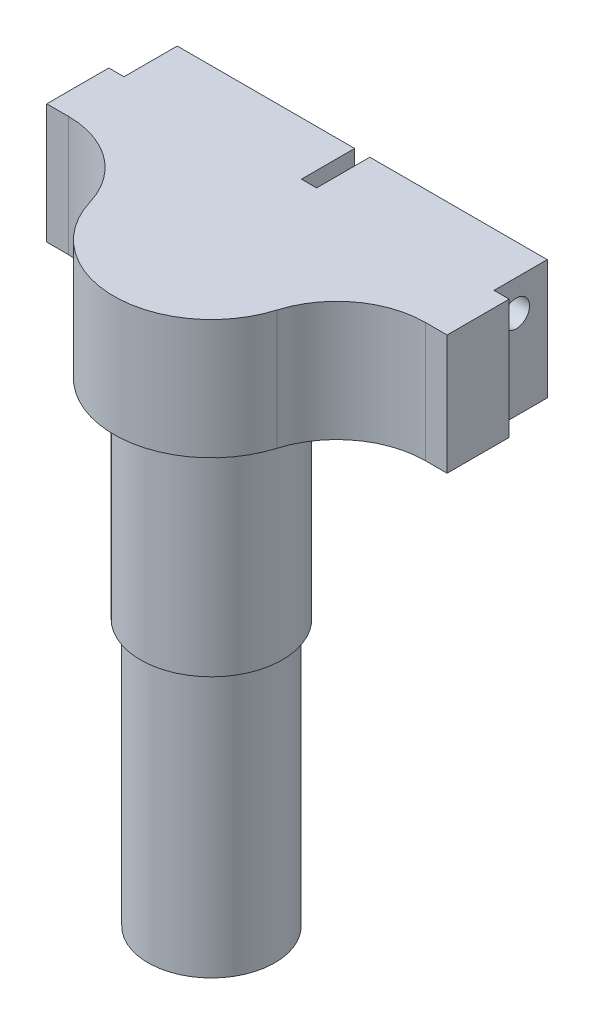
ISO-10303-21;
HEADER;
FILE_DESCRIPTION(('STEP AP214'),'2;1');
FILE_NAME('part.step','',(''),(''),'','','');
FILE_SCHEMA(('AUTOMOTIVE_DESIGN { 1 0 10303 214 1 1 1 1 }'));
ENDSEC;
DATA;
#1=APPLICATION_CONTEXT('core data for automotive mechanical design processes');
#2=APPLICATION_PROTOCOL_DEFINITION('international standard','automotive_design',2000,#1);
#3=PRODUCT_CONTEXT('',#1,'mechanical');
#4=PRODUCT('Part','Part','',(#3));
#5=PRODUCT_RELATED_PRODUCT_CATEGORY('part','',(#4));
#6=PRODUCT_DEFINITION_FORMATION('','',#4);
#7=PRODUCT_DEFINITION_CONTEXT('part definition',#1,'design');
#8=PRODUCT_DEFINITION('design','',#6,#7);
#9=PRODUCT_DEFINITION_SHAPE('','',#8);
#10=(LENGTH_UNIT() NAMED_UNIT(*) SI_UNIT(.MILLI.,.METRE.));
#11=(NAMED_UNIT(*) PLANE_ANGLE_UNIT() SI_UNIT($,.RADIAN.));
#12=(NAMED_UNIT(*) SI_UNIT($,.STERADIAN.) SOLID_ANGLE_UNIT());
#13=UNCERTAINTY_MEASURE_WITH_UNIT(LENGTH_MEASURE(1.E-05),#10,'distance_accuracy_value','');
#14=(GEOMETRIC_REPRESENTATION_CONTEXT(3) GLOBAL_UNCERTAINTY_ASSIGNED_CONTEXT((#13)) GLOBAL_UNIT_ASSIGNED_CONTEXT((#10,
#11,#12)) REPRESENTATION_CONTEXT('',''));
#15=CARTESIAN_POINT('',(0.,0.,0.));
#16=DIRECTION('',(0.,0.,1.));
#17=DIRECTION('',(1.,0.,0.));
#18=AXIS2_PLACEMENT_3D('',#15,#16,#17);
#19=CARTESIAN_POINT('',(22.565,-6.5,8.));
#20=DIRECTION('',(0.,-1.,0.));
#21=DIRECTION('',(0.,0.,-1.));
#22=AXIS2_PLACEMENT_3D('',#19,#20,#21);
#23=PLANE('',#22);
#24=CARTESIAN_POINT('',(22.565,-6.5,8.));
#25=DIRECTION('',(0.,-1.,0.));
#26=DIRECTION('',(0.,0.,-1.));
#27=AXIS2_PLACEMENT_3D('',#24,#25,#26);
#28=CIRCLE('',#27,10.);
#29=CARTESIAN_POINT('',(22.565,-6.5,-2.));
#30=VERTEX_POINT('',#29);
#31=EDGE_CURVE('E11',#30,#30,#28,.F.);
#32=ORIENTED_EDGE('',*,*,#31,.T.);
#33=EDGE_LOOP('',(#32));
#34=FACE_BOUND('',#33,.T.);
#35=DIRECTION('',(1.,0.,0.));
#36=VECTOR('',#35,1.);
#37=CARTESIAN_POINT('',(0.,-6.5,3.99999999999998));
#38=LINE('',#37,#36);
#39=CARTESIAN_POINT('',(42.6896117974981,-6.5,3.99999999999998));
#40=VERTEX_POINT('',#39);
#41=CARTESIAN_POINT('',(45.13,-6.5,3.99999999999998));
#42=VERTEX_POINT('',#41);
#43=EDGE_CURVE('E182',#40,#42,#38,.T.);
#44=ORIENTED_EDGE('',*,*,#43,.F.);
#45=CARTESIAN_POINT('',(42.6896117974981,-6.5,14.));
#46=DIRECTION('',(0.,-1.,0.));
#47=DIRECTION('',(0.,0.,-1.));
#48=AXIS2_PLACEMENT_3D('',#45,#46,#47);
#49=CIRCLE('',#48,10.);
#50=CARTESIAN_POINT('',(33.106463322499,-6.5,11.1428571428571));
#51=VERTEX_POINT('',#50);
#52=EDGE_CURVE('E352',#40,#51,#49,.F.);
#53=ORIENTED_EDGE('',*,*,#52,.T.);
#54=CARTESIAN_POINT('',(22.565,-6.5,8.));
#55=DIRECTION('',(0.,-1.,0.));
#56=DIRECTION('',(0.,0.,-1.));
#57=AXIS2_PLACEMENT_3D('',#54,#55,#56);
#58=CIRCLE('',#57,11.);
#59=CARTESIAN_POINT('',(12.023536677501,-6.5,11.1428571428571));
#60=VERTEX_POINT('',#59);
#61=EDGE_CURVE('E291',#51,#60,#58,.T.);
#62=ORIENTED_EDGE('',*,*,#61,.T.);
#63=CARTESIAN_POINT('',(2.4403882025019,-6.5,14.));
#64=DIRECTION('',(0.,-1.,0.));
#65=DIRECTION('',(0.,0.,-1.));
#66=AXIS2_PLACEMENT_3D('',#63,#64,#65);
#67=CIRCLE('',#66,10.);
#68=CARTESIAN_POINT('',(2.4403882025019,-6.5,3.99999999999998));
#69=VERTEX_POINT('',#68);
#70=EDGE_CURVE('E59',#60,#69,#67,.F.);
#71=ORIENTED_EDGE('',*,*,#70,.T.);
#72=CARTESIAN_POINT('',(0.,-6.5,3.99999999999998));
#73=VERTEX_POINT('',#72);
#74=EDGE_CURVE('E186',#73,#69,#38,.T.);
#75=ORIENTED_EDGE('',*,*,#74,.F.);
#76=DIRECTION('',(0.,0.,-1.));
#77=VECTOR('',#76,1.);
#78=CARTESIAN_POINT('',(0.,-6.5,0.));
#79=LINE('',#78,#77);
#80=CARTESIAN_POINT('',(0.,-6.5,-3.));
#81=VERTEX_POINT('',#80);
#82=EDGE_CURVE('E180',#73,#81,#79,.T.);
#83=ORIENTED_EDGE('',*,*,#82,.T.);
#84=DIRECTION('',(-1.,0.,0.));
#85=VECTOR('',#84,1.);
#86=CARTESIAN_POINT('',(22.565,-6.5,-3.));
#87=LINE('',#86,#85);
#88=CARTESIAN_POINT('',(1.71,-6.5,-3.));
#89=VERTEX_POINT('',#88);
#90=EDGE_CURVE('E261',#89,#81,#87,.T.);
#91=ORIENTED_EDGE('',*,*,#90,.F.);
#92=DIRECTION('',(0.,0.,-1.));
#93=VECTOR('',#92,1.);
#94=CARTESIAN_POINT('',(1.71,-6.5,-6.));
#95=LINE('',#94,#93);
#96=CARTESIAN_POINT('',(1.71,-6.5,-9.));
#97=VERTEX_POINT('',#96);
#98=EDGE_CURVE('E296',#89,#97,#95,.T.);
#99=ORIENTED_EDGE('',*,*,#98,.T.);
#100=DIRECTION('',(-1.,0.,0.));
#101=VECTOR('',#100,1.);
#102=CARTESIAN_POINT('',(22.565,-6.5,-9.));
#103=LINE('',#102,#101);
#104=CARTESIAN_POINT('',(21.71,-6.5,-9.));
#105=VERTEX_POINT('',#104);
#106=EDGE_CURVE('E264',#105,#97,#103,.T.);
#107=ORIENTED_EDGE('',*,*,#106,.F.);
#108=DIRECTION('',(0.,0.,1.));
#109=VECTOR('',#108,1.);
#110=CARTESIAN_POINT('',(21.71,-6.5,-12.));
#111=LINE('',#110,#109);
#112=CARTESIAN_POINT('',(21.71,-6.5,-3.));
#113=VERTEX_POINT('',#112);
#114=EDGE_CURVE('E300',#105,#113,#111,.T.);
#115=ORIENTED_EDGE('',*,*,#114,.T.);
#116=DIRECTION('',(-1.,0.,0.));
#117=VECTOR('',#116,1.);
#118=CARTESIAN_POINT('',(22.565,-6.5,-3.));
#119=LINE('',#118,#117);
#120=CARTESIAN_POINT('',(23.42,-6.5,-3.));
#121=VERTEX_POINT('',#120);
#122=EDGE_CURVE('E268',#121,#113,#119,.T.);
#123=ORIENTED_EDGE('',*,*,#122,.F.);
#124=DIRECTION('',(0.,0.,-1.));
#125=VECTOR('',#124,1.);
#126=CARTESIAN_POINT('',(23.42,-6.5,-6.));
#127=LINE('',#126,#125);
#128=CARTESIAN_POINT('',(23.42,-6.5,-9.));
#129=VERTEX_POINT('',#128);
#130=EDGE_CURVE('E303',#121,#129,#127,.T.);
#131=ORIENTED_EDGE('',*,*,#130,.T.);
#132=DIRECTION('',(-1.,0.,0.));
#133=VECTOR('',#132,1.);
#134=CARTESIAN_POINT('',(22.565,-6.5,-9.));
#135=LINE('',#134,#133);
#136=CARTESIAN_POINT('',(43.42,-6.5,-9.));
#137=VERTEX_POINT('',#136);
#138=EDGE_CURVE('E254',#137,#129,#135,.T.);
#139=ORIENTED_EDGE('',*,*,#138,.F.);
#140=DIRECTION('',(0.,0.,1.));
#141=VECTOR('',#140,1.);
#142=CARTESIAN_POINT('',(43.42,-6.5,-12.));
#143=LINE('',#142,#141);
#144=CARTESIAN_POINT('',(43.42,-6.5,-3.));
#145=VERTEX_POINT('',#144);
#146=EDGE_CURVE('E284',#137,#145,#143,.T.);
#147=ORIENTED_EDGE('',*,*,#146,.T.);
#148=DIRECTION('',(-1.,0.,0.));
#149=VECTOR('',#148,1.);
#150=CARTESIAN_POINT('',(22.565,-6.5,-3.));
#151=LINE('',#150,#149);
#152=CARTESIAN_POINT('',(45.13,-6.5,-3.));
#153=VERTEX_POINT('',#152);
#154=EDGE_CURVE('E257',#153,#145,#151,.T.);
#155=ORIENTED_EDGE('',*,*,#154,.F.);
#156=DIRECTION('',(0.,0.,1.));
#157=VECTOR('',#156,1.);
#158=CARTESIAN_POINT('',(45.13,-6.5,-6.));
#159=LINE('',#158,#157);
#160=EDGE_CURVE('E287',#153,#42,#159,.T.);
#161=ORIENTED_EDGE('',*,*,#160,.T.);
#162=EDGE_LOOP('',(#44,#53,#62,#71,#75,#83,#91,#99,#107,#115,#123,#131,#139,#147,#155,#161));
#163=FACE_BOUND('',#162,.T.);
#164=ADVANCED_FACE('F43',(#34,#163),#23,.T.);
#165=CARTESIAN_POINT('',(22.565,7.,8.));
#166=DIRECTION('',(0.,1.,0.));
#167=DIRECTION('',(0.,0.,1.));
#168=AXIS2_PLACEMENT_3D('',#165,#166,#167);
#169=PLANE('',#168);
#170=DIRECTION('',(-1.,0.,0.));
#171=VECTOR('',#170,1.);
#172=CARTESIAN_POINT('',(45.13,7.,3.99999999999998));
#173=LINE('',#172,#171);
#174=CARTESIAN_POINT('',(2.4403882025019,7.,3.99999999999998));
#175=VERTEX_POINT('',#174);
#176=CARTESIAN_POINT('',(0.,7.,3.99999999999998));
#177=VERTEX_POINT('',#176);
#178=EDGE_CURVE('E156',#175,#177,#173,.T.);
#179=ORIENTED_EDGE('',*,*,#178,.F.);
#180=CARTESIAN_POINT('',(2.4403882025019,7.,14.));
#181=DIRECTION('',(0.,1.,0.));
#182=DIRECTION('',(0.,0.,1.));
#183=AXIS2_PLACEMENT_3D('',#180,#181,#182);
#184=CIRCLE('',#183,10.);
#185=CARTESIAN_POINT('',(12.023536677501,7.,11.1428571428571));
#186=VERTEX_POINT('',#185);
#187=EDGE_CURVE('E357',#175,#186,#184,.F.);
#188=ORIENTED_EDGE('',*,*,#187,.T.);
#189=CARTESIAN_POINT('',(22.565,7.,8.));
#190=DIRECTION('',(0.,1.,0.));
#191=DIRECTION('',(0.,0.,1.));
#192=AXIS2_PLACEMENT_3D('',#189,#190,#191);
#193=CIRCLE('',#192,11.);
#194=CARTESIAN_POINT('',(33.106463322499,7.,11.1428571428571));
#195=VERTEX_POINT('',#194);
#196=EDGE_CURVE('E175',#186,#195,#193,.T.);
#197=ORIENTED_EDGE('',*,*,#196,.T.);
#198=CARTESIAN_POINT('',(42.6896117974981,7.,14.));
#199=DIRECTION('',(0.,1.,0.));
#200=DIRECTION('',(0.,0.,1.));
#201=AXIS2_PLACEMENT_3D('',#198,#199,#200);
#202=CIRCLE('',#201,10.);
#203=CARTESIAN_POINT('',(42.6896117974981,7.,3.99999999999998));
#204=VERTEX_POINT('',#203);
#205=EDGE_CURVE('E349',#195,#204,#202,.F.);
#206=ORIENTED_EDGE('',*,*,#205,.T.);
#207=CARTESIAN_POINT('',(45.13,7.,3.99999999999998));
#208=VERTEX_POINT('',#207);
#209=EDGE_CURVE('E164',#208,#204,#173,.T.);
#210=ORIENTED_EDGE('',*,*,#209,.F.);
#211=DIRECTION('',(0.,0.,-1.));
#212=VECTOR('',#211,1.);
#213=CARTESIAN_POINT('',(45.13,7.,0.));
#214=LINE('',#213,#212);
#215=CARTESIAN_POINT('',(45.13,7.,-3.));
#216=VERTEX_POINT('',#215);
#217=EDGE_CURVE('E307',#208,#216,#214,.T.);
#218=ORIENTED_EDGE('',*,*,#217,.T.);
#219=DIRECTION('',(1.,0.,0.));
#220=VECTOR('',#219,1.);
#221=CARTESIAN_POINT('',(0.,7.,-3.));
#222=LINE('',#221,#220);
#223=CARTESIAN_POINT('',(43.42,7.,-3.));
#224=VERTEX_POINT('',#223);
#225=EDGE_CURVE('E208',#224,#216,#222,.T.);
#226=ORIENTED_EDGE('',*,*,#225,.F.);
#227=DIRECTION('',(0.,0.,-1.));
#228=VECTOR('',#227,1.);
#229=CARTESIAN_POINT('',(43.42,7.,-6.));
#230=LINE('',#229,#228);
#231=CARTESIAN_POINT('',(43.42,7.,-9.));
#232=VERTEX_POINT('',#231);
#233=EDGE_CURVE('E311',#224,#232,#230,.T.);
#234=ORIENTED_EDGE('',*,*,#233,.T.);
#235=DIRECTION('',(1.,0.,0.));
#236=VECTOR('',#235,1.);
#237=CARTESIAN_POINT('',(0.,7.,-9.));
#238=LINE('',#237,#236);
#239=CARTESIAN_POINT('',(23.42,7.,-9.));
#240=VERTEX_POINT('',#239);
#241=EDGE_CURVE('E217',#240,#232,#238,.T.);
#242=ORIENTED_EDGE('',*,*,#241,.F.);
#243=DIRECTION('',(0.,0.,1.));
#244=VECTOR('',#243,1.);
#245=CARTESIAN_POINT('',(23.42,7.,-12.));
#246=LINE('',#245,#244);
#247=CARTESIAN_POINT('',(23.42,7.,-3.));
#248=VERTEX_POINT('',#247);
#249=EDGE_CURVE('E315',#240,#248,#246,.T.);
#250=ORIENTED_EDGE('',*,*,#249,.T.);
#251=DIRECTION('',(1.,0.,0.));
#252=VECTOR('',#251,1.);
#253=CARTESIAN_POINT('',(0.,7.,-3.));
#254=LINE('',#253,#252);
#255=CARTESIAN_POINT('',(21.71,7.,-3.));
#256=VERTEX_POINT('',#255);
#257=EDGE_CURVE('E227',#256,#248,#254,.T.);
#258=ORIENTED_EDGE('',*,*,#257,.F.);
#259=DIRECTION('',(0.,0.,-1.));
#260=VECTOR('',#259,1.);
#261=CARTESIAN_POINT('',(21.71,7.,-6.));
#262=LINE('',#261,#260);
#263=CARTESIAN_POINT('',(21.71,7.,-9.));
#264=VERTEX_POINT('',#263);
#265=EDGE_CURVE('E318',#256,#264,#262,.T.);
#266=ORIENTED_EDGE('',*,*,#265,.T.);
#267=DIRECTION('',(1.,0.,0.));
#268=VECTOR('',#267,1.);
#269=CARTESIAN_POINT('',(0.,7.,-9.));
#270=LINE('',#269,#268);
#271=CARTESIAN_POINT('',(1.71,7.,-9.));
#272=VERTEX_POINT('',#271);
#273=EDGE_CURVE('E209',#272,#264,#270,.T.);
#274=ORIENTED_EDGE('',*,*,#273,.F.);
#275=DIRECTION('',(0.,0.,1.));
#276=VECTOR('',#275,1.);
#277=CARTESIAN_POINT('',(1.71,7.,-12.));
#278=LINE('',#277,#276);
#279=CARTESIAN_POINT('',(1.71,7.,-3.));
#280=VERTEX_POINT('',#279);
#281=EDGE_CURVE('E176',#272,#280,#278,.T.);
#282=ORIENTED_EDGE('',*,*,#281,.T.);
#283=DIRECTION('',(1.,0.,0.));
#284=VECTOR('',#283,1.);
#285=CARTESIAN_POINT('',(0.,7.,-3.));
#286=LINE('',#285,#284);
#287=CARTESIAN_POINT('',(0.,7.,-3.));
#288=VERTEX_POINT('',#287);
#289=EDGE_CURVE('E171',#288,#280,#286,.T.);
#290=ORIENTED_EDGE('',*,*,#289,.F.);
#291=DIRECTION('',(0.,0.,1.));
#292=VECTOR('',#291,1.);
#293=CARTESIAN_POINT('',(0.,7.,-6.));
#294=LINE('',#293,#292);
#295=EDGE_CURVE('E168',#288,#177,#294,.T.);
#296=ORIENTED_EDGE('',*,*,#295,.T.);
#297=EDGE_LOOP('',(#179,#188,#197,#206,#210,#218,#226,#234,#242,#250,#258,#266,#274,#282,#290,#296));
#298=FACE_BOUND('',#297,.T.);
#299=ADVANCED_FACE('F169',(#298),#169,.T.);
#300=CARTESIAN_POINT('',(22.565,-40.,8.));
#301=DIRECTION('',(0.,1.,0.));
#302=DIRECTION('',(0.,0.,1.));
#303=AXIS2_PLACEMENT_3D('',#300,#301,#302);
#304=CYLINDRICAL_SURFACE('',#303,8.);
#305=CARTESIAN_POINT('',(22.565,-8.5,8.));
#306=DIRECTION('',(0.,-1.,0.));
#307=DIRECTION('',(0.,0.,-1.));
#308=AXIS2_PLACEMENT_3D('',#305,#306,#307);
#309=CIRCLE('',#308,8.);
#310=CARTESIAN_POINT('',(22.565,-8.5,0.));
#311=VERTEX_POINT('',#310);
#312=EDGE_CURVE('E52',#311,#311,#309,.T.);
#313=ORIENTED_EDGE('',*,*,#312,.T.);
#314=EDGE_LOOP('',(#313));
#315=FACE_BOUND('',#314,.T.);
#316=CARTESIAN_POINT('',(22.565,-30.,8.));
#317=DIRECTION('',(0.,-1.,0.));
#318=DIRECTION('',(0.,0.,-1.));
#319=AXIS2_PLACEMENT_3D('',#316,#317,#318);
#320=CIRCLE('',#319,8.);
#321=CARTESIAN_POINT('',(22.565,-30.,0.));
#322=VERTEX_POINT('',#321);
#323=EDGE_CURVE('E276',#322,#322,#320,.T.);
#324=ORIENTED_EDGE('',*,*,#323,.F.);
#325=EDGE_LOOP('',(#324));
#326=FACE_BOUND('',#325,.T.);
#327=ADVANCED_FACE('F363',(#315,#326),#304,.T.);
#328=CARTESIAN_POINT('',(23.42,0.,0.));
#329=DIRECTION('',(-1.,0.,0.));
#330=DIRECTION('',(0.,0.,1.));
#331=AXIS2_PLACEMENT_3D('',#328,#329,#330);
#332=PLANE('',#331);
#333=CARTESIAN_POINT('',(23.42,3.5,-5.5));
#334=DIRECTION('',(-1.,0.,0.));
#335=DIRECTION('',(0.,0.,1.));
#336=AXIS2_PLACEMENT_3D('',#333,#334,#335);
#337=CIRCLE('',#336,1.5);
#338=CARTESIAN_POINT('',(23.42,3.5,-4.));
#339=VERTEX_POINT('',#338);
#340=EDGE_CURVE('E204',#339,#339,#337,.T.);
#341=ORIENTED_EDGE('',*,*,#340,.F.);
#342=EDGE_LOOP('',(#341));
#343=FACE_BOUND('',#342,.T.);
#344=DIRECTION('',(0.,1.,0.));
#345=VECTOR('',#344,1.);
#346=CARTESIAN_POINT('',(23.42,-14.,-9.));
#347=LINE('',#346,#345);
#348=EDGE_CURVE('E220',#129,#240,#347,.T.);
#349=ORIENTED_EDGE('',*,*,#348,.F.);
#350=ORIENTED_EDGE('',*,*,#130,.F.);
#351=DIRECTION('',(0.,1.,0.));
#352=VECTOR('',#351,1.);
#353=CARTESIAN_POINT('',(23.42,-14.,-3.));
#354=LINE('',#353,#352);
#355=EDGE_CURVE('E221',#121,#248,#354,.T.);
#356=ORIENTED_EDGE('',*,*,#355,.T.);
#357=ORIENTED_EDGE('',*,*,#249,.F.);
#358=EDGE_LOOP('',(#349,#350,#356,#357));
#359=FACE_BOUND('',#358,.T.);
#360=ADVANCED_FACE('F387',(#343,#359),#332,.T.);
#361=CARTESIAN_POINT('',(21.71,0.,0.));
#362=DIRECTION('',(1.,0.,0.));
#363=DIRECTION('',(0.,0.,-1.));
#364=AXIS2_PLACEMENT_3D('',#361,#362,#363);
#365=PLANE('',#364);
#366=CARTESIAN_POINT('',(21.71,3.5,-5.5));
#367=DIRECTION('',(1.,0.,0.));
#368=DIRECTION('',(0.,0.,-1.));
#369=AXIS2_PLACEMENT_3D('',#366,#367,#368);
#370=CIRCLE('',#369,1.5);
#371=CARTESIAN_POINT('',(21.71,3.5,-7.));
#372=VERTEX_POINT('',#371);
#373=EDGE_CURVE('E200',#372,#372,#370,.T.);
#374=ORIENTED_EDGE('',*,*,#373,.F.);
#375=EDGE_LOOP('',(#374));
#376=FACE_BOUND('',#375,.T.);
#377=DIRECTION('',(0.,1.,0.));
#378=VECTOR('',#377,1.);
#379=CARTESIAN_POINT('',(21.71,-14.,-9.));
#380=LINE('',#379,#378);
#381=EDGE_CURVE('E212',#105,#264,#380,.T.);
#382=ORIENTED_EDGE('',*,*,#381,.T.);
#383=ORIENTED_EDGE('',*,*,#265,.F.);
#384=DIRECTION('',(0.,1.,0.));
#385=VECTOR('',#384,1.);
#386=CARTESIAN_POINT('',(21.71,-14.,-3.));
#387=LINE('',#386,#385);
#388=EDGE_CURVE('E231',#113,#256,#387,.T.);
#389=ORIENTED_EDGE('',*,*,#388,.F.);
#390=ORIENTED_EDGE('',*,*,#114,.F.);
#391=EDGE_LOOP('',(#382,#383,#389,#390));
#392=FACE_BOUND('',#391,.T.);
#393=ADVANCED_FACE('F392',(#376,#392),#365,.T.);
#394=CARTESIAN_POINT('',(1.71,0.,0.));
#395=DIRECTION('',(-1.,0.,0.));
#396=DIRECTION('',(0.,0.,1.));
#397=AXIS2_PLACEMENT_3D('',#394,#395,#396);
#398=PLANE('',#397);
#399=CARTESIAN_POINT('',(1.71,3.5,-5.5));
#400=DIRECTION('',(-1.,0.,0.));
#401=DIRECTION('',(0.,0.,1.));
#402=AXIS2_PLACEMENT_3D('',#399,#400,#401);
#403=CIRCLE('',#402,1.5);
#404=CARTESIAN_POINT('',(1.71,3.5,-4.));
#405=VERTEX_POINT('',#404);
#406=EDGE_CURVE('E195',#405,#405,#403,.T.);
#407=ORIENTED_EDGE('',*,*,#406,.F.);
#408=EDGE_LOOP('',(#407));
#409=FACE_BOUND('',#408,.T.);
#410=DIRECTION('',(0.,1.,0.));
#411=VECTOR('',#410,1.);
#412=CARTESIAN_POINT('',(1.71,0.,-9.));
#413=LINE('',#412,#411);
#414=EDGE_CURVE('E330',#97,#272,#413,.T.);
#415=ORIENTED_EDGE('',*,*,#414,.F.);
#416=ORIENTED_EDGE('',*,*,#98,.F.);
#417=DIRECTION('',(0.,1.,0.));
#418=VECTOR('',#417,1.);
#419=CARTESIAN_POINT('',(1.71,-14.,-3.));
#420=LINE('',#419,#418);
#421=EDGE_CURVE('E250',#89,#280,#420,.T.);
#422=ORIENTED_EDGE('',*,*,#421,.T.);
#423=ORIENTED_EDGE('',*,*,#281,.F.);
#424=EDGE_LOOP('',(#415,#416,#422,#423));
#425=FACE_BOUND('',#424,.T.);
#426=ADVANCED_FACE('F389',(#409,#425),#398,.T.);
#427=CARTESIAN_POINT('',(0.,10.,0.));
#428=DIRECTION('',(-1.,0.,0.));
#429=DIRECTION('',(0.,0.,1.));
#430=AXIS2_PLACEMENT_3D('',#427,#428,#429);
#431=PLANE('',#430);
#432=DIRECTION('',(0.,1.,0.));
#433=VECTOR('',#432,1.);
#434=CARTESIAN_POINT('',(0.,10.,-3.));
#435=LINE('',#434,#433);
#436=EDGE_CURVE('E327',#81,#288,#435,.T.);
#437=ORIENTED_EDGE('',*,*,#436,.F.);
#438=ORIENTED_EDGE('',*,*,#82,.F.);
#439=DIRECTION('',(0.,-1.,0.));
#440=VECTOR('',#439,1.);
#441=CARTESIAN_POINT('',(0.,7.,3.99999999999998));
#442=LINE('',#441,#440);
#443=EDGE_CURVE('E160',#177,#73,#442,.T.);
#444=ORIENTED_EDGE('',*,*,#443,.F.);
#445=ORIENTED_EDGE('',*,*,#295,.F.);
#446=EDGE_LOOP('',(#437,#438,#444,#445));
#447=FACE_BOUND('',#446,.T.);
#448=ADVANCED_FACE('F178',(#447),#431,.T.);
#449=CARTESIAN_POINT('',(22.565,10.,8.));
#450=DIRECTION('',(0.,-1.,0.));
#451=DIRECTION('',(0.,0.,-1.));
#452=AXIS2_PLACEMENT_3D('',#449,#450,#451);
#453=CYLINDRICAL_SURFACE('',#452,11.);
#454=ORIENTED_EDGE('',*,*,#61,.F.);
#455=DIRECTION('',(0.,-1.,0.));
#456=VECTOR('',#455,1.);
#457=CARTESIAN_POINT('',(33.106463322499,10.,11.1428571428571));
#458=LINE('',#457,#456);
#459=EDGE_CURVE('E340',#51,#195,#458,.F.);
#460=ORIENTED_EDGE('',*,*,#459,.T.);
#461=ORIENTED_EDGE('',*,*,#196,.F.);
#462=DIRECTION('',(0.,-1.,0.));
#463=VECTOR('',#462,1.);
#464=CARTESIAN_POINT('',(12.023536677501,10.,11.1428571428571));
#465=LINE('',#464,#463);
#466=EDGE_CURVE('E333',#186,#60,#465,.T.);
#467=ORIENTED_EDGE('',*,*,#466,.T.);
#468=EDGE_LOOP('',(#454,#460,#461,#467));
#469=FACE_BOUND('',#468,.T.);
#470=ADVANCED_FACE('F408',(#469),#453,.T.);
#471=CARTESIAN_POINT('',(45.13,10.,0.));
#472=DIRECTION('',(1.,0.,0.));
#473=DIRECTION('',(0.,0.,-1.));
#474=AXIS2_PLACEMENT_3D('',#471,#472,#473);
#475=PLANE('',#474);
#476=DIRECTION('',(0.,1.,0.));
#477=VECTOR('',#476,1.);
#478=CARTESIAN_POINT('',(45.13,-14.,-3.));
#479=LINE('',#478,#477);
#480=EDGE_CURVE('E232',#153,#216,#479,.T.);
#481=ORIENTED_EDGE('',*,*,#480,.T.);
#482=ORIENTED_EDGE('',*,*,#217,.F.);
#483=DIRECTION('',(0.,1.,0.));
#484=VECTOR('',#483,1.);
#485=CARTESIAN_POINT('',(45.13,-6.5,3.99999999999998));
#486=LINE('',#485,#484);
#487=EDGE_CURVE('E191',#42,#208,#486,.T.);
#488=ORIENTED_EDGE('',*,*,#487,.F.);
#489=ORIENTED_EDGE('',*,*,#160,.F.);
#490=EDGE_LOOP('',(#481,#482,#488,#489));
#491=FACE_BOUND('',#490,.T.);
#492=ADVANCED_FACE('F404',(#491),#475,.T.);
#493=CARTESIAN_POINT('',(43.42,0.,0.));
#494=DIRECTION('',(1.,0.,0.));
#495=DIRECTION('',(0.,0.,-1.));
#496=AXIS2_PLACEMENT_3D('',#493,#494,#495);
#497=PLANE('',#496);
#498=CARTESIAN_POINT('',(43.42,3.5,-5.5));
#499=DIRECTION('',(1.,0.,0.));
#500=DIRECTION('',(0.,0.,-1.));
#501=AXIS2_PLACEMENT_3D('',#498,#499,#500);
#502=CIRCLE('',#501,1.5);
#503=CARTESIAN_POINT('',(43.42,3.5,-7.));
#504=VERTEX_POINT('',#503);
#505=EDGE_CURVE('E199',#504,#504,#502,.T.);
#506=ORIENTED_EDGE('',*,*,#505,.F.);
#507=EDGE_LOOP('',(#506));
#508=FACE_BOUND('',#507,.T.);
#509=DIRECTION('',(0.,1.,0.));
#510=VECTOR('',#509,1.);
#511=CARTESIAN_POINT('',(43.42,-14.,-9.));
#512=LINE('',#511,#510);
#513=EDGE_CURVE('E213',#137,#232,#512,.T.);
#514=ORIENTED_EDGE('',*,*,#513,.T.);
#515=ORIENTED_EDGE('',*,*,#233,.F.);
#516=DIRECTION('',(0.,1.,0.));
#517=VECTOR('',#516,1.);
#518=CARTESIAN_POINT('',(43.42,-14.,-3.));
#519=LINE('',#518,#517);
#520=EDGE_CURVE('E241',#145,#224,#519,.T.);
#521=ORIENTED_EDGE('',*,*,#520,.F.);
#522=ORIENTED_EDGE('',*,*,#146,.F.);
#523=EDGE_LOOP('',(#514,#515,#521,#522));
#524=FACE_BOUND('',#523,.T.);
#525=ADVANCED_FACE('F400',(#508,#524),#497,.T.);
#526=CARTESIAN_POINT('',(22.565,-30.,8.));
#527=DIRECTION('',(0.,-1.,0.));
#528=DIRECTION('',(0.,0.,-1.));
#529=AXIS2_PLACEMENT_3D('',#526,#527,#528);
#530=PLANE('',#529);
#531=CARTESIAN_POINT('',(22.565,-30.,8.));
#532=DIRECTION('',(0.,-1.,0.));
#533=DIRECTION('',(0.,0.,-1.));
#534=AXIS2_PLACEMENT_3D('',#531,#532,#533);
#535=CIRCLE('',#534,7.15);
#536=CARTESIAN_POINT('',(22.565,-30.,0.850000000000002));
#537=VERTEX_POINT('',#536);
#538=EDGE_CURVE('E272',#537,#537,#535,.T.);
#539=ORIENTED_EDGE('',*,*,#538,.F.);
#540=EDGE_LOOP('',(#539));
#541=FACE_BOUND('',#540,.T.);
#542=ORIENTED_EDGE('',*,*,#323,.T.);
#543=EDGE_LOOP('',(#542));
#544=FACE_BOUND('',#543,.T.);
#545=ADVANCED_FACE('F403',(#541,#544),#530,.T.);
#546=CARTESIAN_POINT('',(22.565,-60.,8.));
#547=DIRECTION('',(0.,-1.,0.));
#548=DIRECTION('',(0.,0.,-1.));
#549=AXIS2_PLACEMENT_3D('',#546,#547,#548);
#550=PLANE('',#549);
#551=CARTESIAN_POINT('',(22.565,-60.,8.));
#552=DIRECTION('',(0.,-1.,0.));
#553=DIRECTION('',(0.,0.,-1.));
#554=AXIS2_PLACEMENT_3D('',#551,#552,#553);
#555=CIRCLE('',#554,7.15);
#556=CARTESIAN_POINT('',(22.565,-60.,0.850000000000002));
#557=VERTEX_POINT('',#556);
#558=EDGE_CURVE('E280',#557,#557,#555,.T.);
#559=ORIENTED_EDGE('',*,*,#558,.T.);
#560=EDGE_LOOP('',(#559));
#561=FACE_BOUND('',#560,.T.);
#562=ADVANCED_FACE('F476',(#561),#550,.T.);
#563=CARTESIAN_POINT('',(22.565,-3.7657323800348,8.));
#564=DIRECTION('',(0.,-1.,0.));
#565=DIRECTION('',(0.,0.,-1.));
#566=AXIS2_PLACEMENT_3D('',#563,#564,#565);
#567=CYLINDRICAL_SURFACE('',#566,7.15);
#568=ORIENTED_EDGE('',*,*,#558,.F.);
#569=EDGE_LOOP('',(#568));
#570=FACE_BOUND('',#569,.T.);
#571=ORIENTED_EDGE('',*,*,#538,.T.);
#572=EDGE_LOOP('',(#571));
#573=FACE_BOUND('',#572,.T.);
#574=ADVANCED_FACE('F384',(#570,#573),#567,.T.);
#575=CARTESIAN_POINT('',(0.,-14.,-9.));
#576=DIRECTION('',(0.,0.,1.));
#577=DIRECTION('',(1.,0.,0.));
#578=AXIS2_PLACEMENT_3D('',#575,#576,#577);
#579=PLANE('',#578);
#580=ORIENTED_EDGE('',*,*,#348,.T.);
#581=ORIENTED_EDGE('',*,*,#241,.T.);
#582=ORIENTED_EDGE('',*,*,#513,.F.);
#583=ORIENTED_EDGE('',*,*,#138,.T.);
#584=EDGE_LOOP('',(#580,#581,#582,#583));
#585=FACE_BOUND('',#584,.T.);
#586=ADVANCED_FACE('F443',(#585),#579,.F.);
#587=CARTESIAN_POINT('',(0.,-14.,-3.));
#588=DIRECTION('',(0.,0.,1.));
#589=DIRECTION('',(1.,0.,0.));
#590=AXIS2_PLACEMENT_3D('',#587,#588,#589);
#591=PLANE('',#590);
#592=ORIENTED_EDGE('',*,*,#154,.T.);
#593=ORIENTED_EDGE('',*,*,#520,.T.);
#594=ORIENTED_EDGE('',*,*,#225,.T.);
#595=ORIENTED_EDGE('',*,*,#480,.F.);
#596=EDGE_LOOP('',(#592,#593,#594,#595));
#597=FACE_BOUND('',#596,.T.);
#598=ADVANCED_FACE('F436',(#597),#591,.F.);
#599=CARTESIAN_POINT('',(0.,-14.,-3.));
#600=DIRECTION('',(0.,0.,1.));
#601=DIRECTION('',(1.,0.,0.));
#602=AXIS2_PLACEMENT_3D('',#599,#600,#601);
#603=PLANE('',#602);
#604=ORIENTED_EDGE('',*,*,#90,.T.);
#605=ORIENTED_EDGE('',*,*,#436,.T.);
#606=ORIENTED_EDGE('',*,*,#289,.T.);
#607=ORIENTED_EDGE('',*,*,#421,.F.);
#608=EDGE_LOOP('',(#604,#605,#606,#607));
#609=FACE_BOUND('',#608,.T.);
#610=ADVANCED_FACE('F464',(#609),#603,.F.);
#611=CARTESIAN_POINT('',(0.,-14.,-9.));
#612=DIRECTION('',(0.,0.,1.));
#613=DIRECTION('',(1.,0.,0.));
#614=AXIS2_PLACEMENT_3D('',#611,#612,#613);
#615=PLANE('',#614);
#616=ORIENTED_EDGE('',*,*,#414,.T.);
#617=ORIENTED_EDGE('',*,*,#273,.T.);
#618=ORIENTED_EDGE('',*,*,#381,.F.);
#619=ORIENTED_EDGE('',*,*,#106,.T.);
#620=EDGE_LOOP('',(#616,#617,#618,#619));
#621=FACE_BOUND('',#620,.T.);
#622=ADVANCED_FACE('F459',(#621),#615,.F.);
#623=CARTESIAN_POINT('',(0.,-14.,-3.));
#624=DIRECTION('',(0.,0.,1.));
#625=DIRECTION('',(1.,0.,0.));
#626=AXIS2_PLACEMENT_3D('',#623,#624,#625);
#627=PLANE('',#626);
#628=ORIENTED_EDGE('',*,*,#122,.T.);
#629=ORIENTED_EDGE('',*,*,#388,.T.);
#630=ORIENTED_EDGE('',*,*,#257,.T.);
#631=ORIENTED_EDGE('',*,*,#355,.F.);
#632=EDGE_LOOP('',(#628,#629,#630,#631));
#633=FACE_BOUND('',#632,.T.);
#634=ADVANCED_FACE('F450',(#633),#627,.F.);
#635=CARTESIAN_POINT('',(51.71,3.5,-5.5));
#636=DIRECTION('',(-1.,0.,0.));
#637=DIRECTION('',(0.,0.,1.));
#638=AXIS2_PLACEMENT_3D('',#635,#636,#637);
#639=CYLINDRICAL_SURFACE('',#638,1.5);
#640=ORIENTED_EDGE('',*,*,#340,.T.);
#641=EDGE_LOOP('',(#640));
#642=FACE_BOUND('',#641,.T.);
#643=ORIENTED_EDGE('',*,*,#505,.T.);
#644=EDGE_LOOP('',(#643));
#645=FACE_BOUND('',#644,.T.);
#646=ADVANCED_FACE('F497',(#642,#645),#639,.F.);
#647=ORIENTED_EDGE('',*,*,#373,.T.);
#648=EDGE_LOOP('',(#647));
#649=FACE_BOUND('',#648,.T.);
#650=ORIENTED_EDGE('',*,*,#406,.T.);
#651=EDGE_LOOP('',(#650));
#652=FACE_BOUND('',#651,.T.);
#653=ADVANCED_FACE('F501',(#649,#652),#639,.F.);
#654=CARTESIAN_POINT('',(0.,0.,3.99999999999998));
#655=DIRECTION('',(0.,0.,1.));
#656=DIRECTION('',(1.,0.,0.));
#657=AXIS2_PLACEMENT_3D('',#654,#655,#656);
#658=PLANE('',#657);
#659=ORIENTED_EDGE('',*,*,#209,.T.);
#660=DIRECTION('',(0.,-1.,0.));
#661=VECTOR('',#660,1.);
#662=CARTESIAN_POINT('',(42.6896117974981,0.,3.99999999999998));
#663=LINE('',#662,#661);
#664=EDGE_CURVE('E344',#204,#40,#663,.T.);
#665=ORIENTED_EDGE('',*,*,#664,.T.);
#666=ORIENTED_EDGE('',*,*,#43,.T.);
#667=ORIENTED_EDGE('',*,*,#487,.T.);
#668=EDGE_LOOP('',(#659,#665,#666,#667));
#669=FACE_BOUND('',#668,.T.);
#670=ADVANCED_FACE('F420',(#669),#658,.T.);
#671=ORIENTED_EDGE('',*,*,#74,.T.);
#672=DIRECTION('',(0.,-1.,0.));
#673=VECTOR('',#672,1.);
#674=CARTESIAN_POINT('',(2.4403882025019,0.,3.99999999999998));
#675=LINE('',#674,#673);
#676=EDGE_CURVE('E66',#69,#175,#675,.F.);
#677=ORIENTED_EDGE('',*,*,#676,.T.);
#678=ORIENTED_EDGE('',*,*,#178,.T.);
#679=ORIENTED_EDGE('',*,*,#443,.T.);
#680=EDGE_LOOP('',(#671,#677,#678,#679));
#681=FACE_BOUND('',#680,.T.);
#682=ADVANCED_FACE('F158',(#681),#658,.T.);
#683=CARTESIAN_POINT('',(42.6896117974981,10.,14.));
#684=DIRECTION('',(0.,-1.,0.));
#685=DIRECTION('',(0.,0.,-1.));
#686=AXIS2_PLACEMENT_3D('',#683,#684,#685);
#687=CYLINDRICAL_SURFACE('',#686,10.);
#688=ORIENTED_EDGE('',*,*,#52,.F.);
#689=ORIENTED_EDGE('',*,*,#664,.F.);
#690=ORIENTED_EDGE('',*,*,#205,.F.);
#691=ORIENTED_EDGE('',*,*,#459,.F.);
#692=EDGE_LOOP('',(#688,#689,#690,#691));
#693=FACE_BOUND('',#692,.T.);
#694=ADVANCED_FACE('F372',(#693),#687,.F.);
#695=CARTESIAN_POINT('',(2.4403882025019,10.,14.));
#696=DIRECTION('',(0.,-1.,0.));
#697=DIRECTION('',(0.,0.,-1.));
#698=AXIS2_PLACEMENT_3D('',#695,#696,#697);
#699=CYLINDRICAL_SURFACE('',#698,10.);
#700=ORIENTED_EDGE('',*,*,#187,.F.);
#701=ORIENTED_EDGE('',*,*,#676,.F.);
#702=ORIENTED_EDGE('',*,*,#70,.F.);
#703=ORIENTED_EDGE('',*,*,#466,.F.);
#704=EDGE_LOOP('',(#700,#701,#702,#703));
#705=FACE_BOUND('',#704,.T.);
#706=ADVANCED_FACE('F367',(#705),#699,.F.);
#707=CARTESIAN_POINT('',(22.565,-8.5,8.));
#708=DIRECTION('',(0.,-1.,0.));
#709=DIRECTION('',(0.,0.,-1.));
#710=AXIS2_PLACEMENT_3D('',#707,#708,#709);
#711=TOROIDAL_SURFACE('',#710,10.,2.);
#712=ORIENTED_EDGE('',*,*,#31,.F.);
#713=EDGE_LOOP('',(#712));
#714=FACE_BOUND('',#713,.T.);
#715=ORIENTED_EDGE('',*,*,#312,.F.);
#716=EDGE_LOOP('',(#715));
#717=FACE_BOUND('',#716,.T.);
#718=ADVANCED_FACE('F45',(#714,#717),#711,.F.);
#719=CLOSED_SHELL('',(#164,#299,#327,#360,#393,#426,#448,#470,#492,#525,#545,#562,#574,#586,
#598,#610,#622,#634,#646,#653,#670,#682,#694,#706,#718));
#720=MANIFOLD_SOLID_BREP('B2',#719);
#721=ADVANCED_BREP_SHAPE_REPRESENTATION('',(#18,#720),#14);
#722=SHAPE_DEFINITION_REPRESENTATION(#9,#721);
ENDSEC;
END-ISO-10303-21;
